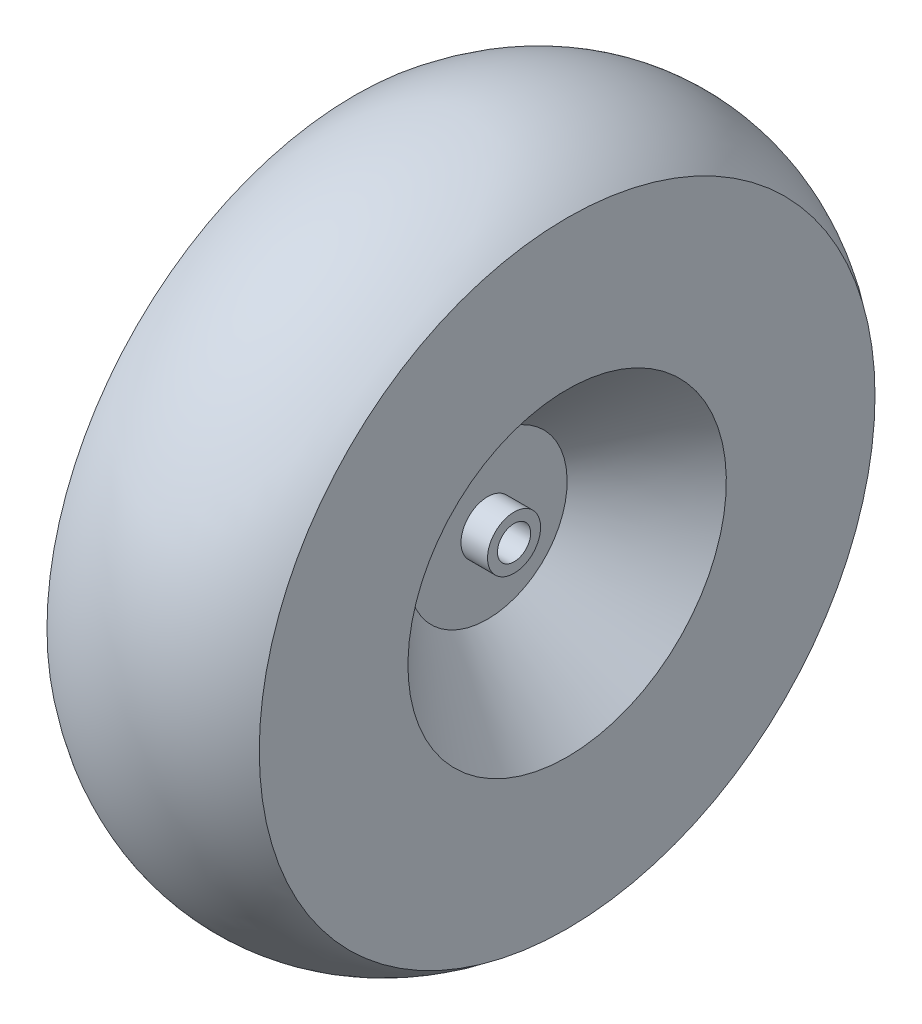
ISO-10303-21;
HEADER;
FILE_DESCRIPTION(('STEP AP214'),'2;1');
FILE_NAME('part.step','',(''),(''),'','','');
FILE_SCHEMA(('AUTOMOTIVE_DESIGN { 1 0 10303 214 1 1 1 1 }'));
ENDSEC;
DATA;
#1=APPLICATION_CONTEXT('core data for automotive mechanical design processes');
#2=APPLICATION_PROTOCOL_DEFINITION('international standard','automotive_design',2000,#1);
#3=PRODUCT_CONTEXT('',#1,'mechanical');
#4=PRODUCT('Part','Part','',(#3));
#5=PRODUCT_RELATED_PRODUCT_CATEGORY('part','',(#4));
#6=PRODUCT_DEFINITION_FORMATION('','',#4);
#7=PRODUCT_DEFINITION_CONTEXT('part definition',#1,'design');
#8=PRODUCT_DEFINITION('design','',#6,#7);
#9=PRODUCT_DEFINITION_SHAPE('','',#8);
#10=(LENGTH_UNIT() NAMED_UNIT(*) SI_UNIT(.MILLI.,.METRE.));
#11=(NAMED_UNIT(*) PLANE_ANGLE_UNIT() SI_UNIT($,.RADIAN.));
#12=(NAMED_UNIT(*) SI_UNIT($,.STERADIAN.) SOLID_ANGLE_UNIT());
#13=UNCERTAINTY_MEASURE_WITH_UNIT(LENGTH_MEASURE(1.E-05),#10,'distance_accuracy_value','');
#14=(GEOMETRIC_REPRESENTATION_CONTEXT(3) GLOBAL_UNCERTAINTY_ASSIGNED_CONTEXT((#13)) GLOBAL_UNIT_ASSIGNED_CONTEXT((#10,
#11,#12)) REPRESENTATION_CONTEXT('',''));
#15=CARTESIAN_POINT('',(0.,0.,0.));
#16=DIRECTION('',(0.,0.,1.));
#17=DIRECTION('',(1.,0.,0.));
#18=AXIS2_PLACEMENT_3D('',#15,#16,#17);
#19=CARTESIAN_POINT('',(50.8,0.,0.));
#20=DIRECTION('',(-1.,0.,0.));
#21=DIRECTION('',(0.,-1.,0.));
#22=AXIS2_PLACEMENT_3D('',#19,#20,#21);
#23=PLANE('',#22);
#24=CARTESIAN_POINT('',(50.8,0.,0.));
#25=DIRECTION('',(-1.,0.,0.));
#26=DIRECTION('',(0.,-1.,0.));
#27=AXIS2_PLACEMENT_3D('',#24,#25,#26);
#28=CIRCLE('',#27,147.358651079845);
#29=CARTESIAN_POINT('',(50.8,-147.358651079845,0.));
#30=VERTEX_POINT('',#29);
#31=EDGE_CURVE('E10',#30,#30,#28,.T.);
#32=ORIENTED_EDGE('',*,*,#31,.F.);
#33=EDGE_LOOP('',(#32));
#34=FACE_BOUND('',#33,.T.);
#35=CARTESIAN_POINT('',(50.8,0.,0.));
#36=DIRECTION('',(-1.,0.,0.));
#37=DIRECTION('',(0.,-1.,0.));
#38=AXIS2_PLACEMENT_3D('',#35,#36,#37);
#39=CIRCLE('',#38,76.2);
#40=CARTESIAN_POINT('',(50.8,-76.2,0.));
#41=VERTEX_POINT('',#40);
#42=EDGE_CURVE('E83',#41,#41,#39,.T.);
#43=ORIENTED_EDGE('',*,*,#42,.T.);
#44=EDGE_LOOP('',(#43));
#45=FACE_BOUND('',#44,.T.);
#46=ADVANCED_FACE('F43',(#34,#45),#23,.F.);
#47=CARTESIAN_POINT('',(0.,79.5701073445165,0.));
#48=DIRECTION('',(0.,0.,1.));
#49=DIRECTION('',(0.,-1.,0.));
#50=AXIS2_PLACEMENT_3D('',#47,#48,#49);
#51=ELLIPSE('',#50,85.5298926554835,83.3088481565609);
#52=TRIMMED_CURVE('',#51,(PARAMETER_VALUE(0.375513902886624)),
(PARAMETER_VALUE(5.90767140429296)),.T.,.PARAMETER.);
#53=CARTESIAN_POINT('',(-25.4,0.,0.));
#54=DIRECTION('',(-1.,0.,0.));
#55=AXIS1_PLACEMENT('',#53,#54);
#56=SURFACE_OF_REVOLUTION('',#52,#55);
#57=CARTESIAN_POINT('',(-50.8,0.,0.));
#58=DIRECTION('',(-1.,0.,0.));
#59=DIRECTION('',(0.,-1.,0.));
#60=AXIS2_PLACEMENT_3D('',#57,#58,#59);
#61=CIRCLE('',#60,147.358651079845);
#62=CARTESIAN_POINT('',(-50.7999999999999,-147.358651079845,0.));
#63=VERTEX_POINT('',#62);
#64=EDGE_CURVE('E49',#63,#63,#61,.T.);
#65=ORIENTED_EDGE('',*,*,#64,.F.);
#66=EDGE_LOOP('',(#65));
#67=FACE_BOUND('',#66,.T.);
#68=ORIENTED_EDGE('',*,*,#31,.T.);
#69=EDGE_LOOP('',(#68));
#70=FACE_BOUND('',#69,.T.);
#71=ADVANCED_FACE('F87',(#67,#70),#56,.T.);
#72=CARTESIAN_POINT('',(-50.8,0.,0.));
#73=DIRECTION('',(-1.,0.,0.));
#74=DIRECTION('',(0.,-1.,0.));
#75=AXIS2_PLACEMENT_3D('',#72,#73,#74);
#76=PLANE('',#75);
#77=ORIENTED_EDGE('',*,*,#64,.T.);
#78=EDGE_LOOP('',(#77));
#79=FACE_BOUND('',#78,.T.);
#80=CARTESIAN_POINT('',(-50.8,0.,0.));
#81=DIRECTION('',(-1.,0.,0.));
#82=DIRECTION('',(0.,-1.,0.));
#83=AXIS2_PLACEMENT_3D('',#80,#81,#82);
#84=CIRCLE('',#83,76.2);
#85=CARTESIAN_POINT('',(-50.8,-76.2,0.));
#86=VERTEX_POINT('',#85);
#87=EDGE_CURVE('E53',#86,#86,#84,.T.);
#88=ORIENTED_EDGE('',*,*,#87,.F.);
#89=EDGE_LOOP('',(#88));
#90=FACE_BOUND('',#89,.T.);
#91=ADVANCED_FACE('F90',(#79,#90),#76,.T.);
#92=CARTESIAN_POINT('',(-12.7,0.,0.));
#93=DIRECTION('',(-1.,0.,0.));
#94=DIRECTION('',(0.,-1.,0.));
#95=AXIS2_PLACEMENT_3D('',#92,#93,#94);
#96=CONICAL_SURFACE('',#95,38.0999999999999,0.78539816339745);
#97=ORIENTED_EDGE('',*,*,#87,.T.);
#98=EDGE_LOOP('',(#97));
#99=FACE_BOUND('',#98,.T.);
#100=CARTESIAN_POINT('',(-12.7,0.,0.));
#101=DIRECTION('',(-1.,0.,0.));
#102=DIRECTION('',(0.,-1.,0.));
#103=AXIS2_PLACEMENT_3D('',#100,#101,#102);
#104=CIRCLE('',#103,38.0999999999999);
#105=CARTESIAN_POINT('',(-12.7,-38.0999999999999,0.));
#106=VERTEX_POINT('',#105);
#107=EDGE_CURVE('E57',#106,#106,#104,.T.);
#108=ORIENTED_EDGE('',*,*,#107,.F.);
#109=EDGE_LOOP('',(#108));
#110=FACE_BOUND('',#109,.T.);
#111=ADVANCED_FACE('F94',(#99,#110),#96,.F.);
#112=CARTESIAN_POINT('',(-12.7,0.,0.));
#113=DIRECTION('',(-1.,0.,0.));
#114=DIRECTION('',(0.,-1.,0.));
#115=AXIS2_PLACEMENT_3D('',#112,#113,#114);
#116=PLANE('',#115);
#117=ORIENTED_EDGE('',*,*,#107,.T.);
#118=EDGE_LOOP('',(#117));
#119=FACE_BOUND('',#118,.T.);
#120=CARTESIAN_POINT('',(-12.7,0.,0.));
#121=DIRECTION('',(-1.,0.,0.));
#122=DIRECTION('',(0.,-1.,0.));
#123=AXIS2_PLACEMENT_3D('',#120,#121,#122);
#124=CIRCLE('',#123,12.7);
#125=CARTESIAN_POINT('',(-12.7,-12.7,0.));
#126=VERTEX_POINT('',#125);
#127=EDGE_CURVE('E62',#126,#126,#124,.T.);
#128=ORIENTED_EDGE('',*,*,#127,.F.);
#129=EDGE_LOOP('',(#128));
#130=FACE_BOUND('',#129,.T.);
#131=ADVANCED_FACE('F97',(#119,#130),#116,.T.);
#132=CARTESIAN_POINT('',(-25.4,0.,0.));
#133=DIRECTION('',(-1.,0.,0.));
#134=DIRECTION('',(0.,-1.,0.));
#135=AXIS2_PLACEMENT_3D('',#132,#133,#134);
#136=CYLINDRICAL_SURFACE('',#135,12.7);
#137=CARTESIAN_POINT('',(-25.4,0.,0.));
#138=DIRECTION('',(-1.,0.,0.));
#139=DIRECTION('',(0.,-1.,0.));
#140=AXIS2_PLACEMENT_3D('',#137,#138,#139);
#141=CIRCLE('',#140,12.7);
#142=CARTESIAN_POINT('',(-25.4,-12.7,0.));
#143=VERTEX_POINT('',#142);
#144=EDGE_CURVE('E65',#143,#143,#141,.T.);
#145=ORIENTED_EDGE('',*,*,#144,.F.);
#146=EDGE_LOOP('',(#145));
#147=FACE_BOUND('',#146,.T.);
#148=ORIENTED_EDGE('',*,*,#127,.T.);
#149=EDGE_LOOP('',(#148));
#150=FACE_BOUND('',#149,.T.);
#151=ADVANCED_FACE('F101',(#147,#150),#136,.T.);
#152=CARTESIAN_POINT('',(-25.4,0.,0.));
#153=DIRECTION('',(-1.,0.,0.));
#154=DIRECTION('',(0.,-1.,0.));
#155=AXIS2_PLACEMENT_3D('',#152,#153,#154);
#156=PLANE('',#155);
#157=ORIENTED_EDGE('',*,*,#144,.T.);
#158=EDGE_LOOP('',(#157));
#159=FACE_BOUND('',#158,.T.);
#160=CARTESIAN_POINT('',(-25.4,0.,0.));
#161=DIRECTION('',(-1.,0.,0.));
#162=DIRECTION('',(0.,-1.,0.));
#163=AXIS2_PLACEMENT_3D('',#160,#161,#162);
#164=CIRCLE('',#163,7.93749999999999);
#165=CARTESIAN_POINT('',(-25.4,-7.93749999999999,0.));
#166=VERTEX_POINT('',#165);
#167=EDGE_CURVE('E68',#166,#166,#164,.T.);
#168=ORIENTED_EDGE('',*,*,#167,.F.);
#169=EDGE_LOOP('',(#168));
#170=FACE_BOUND('',#169,.T.);
#171=ADVANCED_FACE('F105',(#159,#170),#156,.T.);
#172=CARTESIAN_POINT('',(-25.4,0.,0.));
#173=DIRECTION('',(-1.,0.,0.));
#174=DIRECTION('',(0.,-1.,0.));
#175=AXIS2_PLACEMENT_3D('',#172,#173,#174);
#176=CYLINDRICAL_SURFACE('',#175,7.93749999999999);
#177=ORIENTED_EDGE('',*,*,#167,.T.);
#178=EDGE_LOOP('',(#177));
#179=FACE_BOUND('',#178,.T.);
#180=CARTESIAN_POINT('',(25.4,0.,0.));
#181=DIRECTION('',(-1.,0.,0.));
#182=DIRECTION('',(0.,-1.,0.));
#183=AXIS2_PLACEMENT_3D('',#180,#181,#182);
#184=CIRCLE('',#183,7.93749999999999);
#185=CARTESIAN_POINT('',(25.4,-7.93749999999998,0.));
#186=VERTEX_POINT('',#185);
#187=EDGE_CURVE('E71',#186,#186,#184,.T.);
#188=ORIENTED_EDGE('',*,*,#187,.F.);
#189=EDGE_LOOP('',(#188));
#190=FACE_BOUND('',#189,.T.);
#191=ADVANCED_FACE('F109',(#179,#190),#176,.F.);
#192=CARTESIAN_POINT('',(25.4,0.,0.));
#193=DIRECTION('',(-1.,0.,0.));
#194=DIRECTION('',(0.,-1.,0.));
#195=AXIS2_PLACEMENT_3D('',#192,#193,#194);
#196=PLANE('',#195);
#197=CARTESIAN_POINT('',(25.4,0.,0.));
#198=DIRECTION('',(-1.,0.,0.));
#199=DIRECTION('',(0.,-1.,0.));
#200=AXIS2_PLACEMENT_3D('',#197,#198,#199);
#201=CIRCLE('',#200,12.7);
#202=CARTESIAN_POINT('',(25.4,-12.7,0.));
#203=VERTEX_POINT('',#202);
#204=EDGE_CURVE('E74',#203,#203,#201,.T.);
#205=ORIENTED_EDGE('',*,*,#204,.F.);
#206=EDGE_LOOP('',(#205));
#207=FACE_BOUND('',#206,.T.);
#208=ORIENTED_EDGE('',*,*,#187,.T.);
#209=EDGE_LOOP('',(#208));
#210=FACE_BOUND('',#209,.T.);
#211=ADVANCED_FACE('F113',(#207,#210),#196,.F.);
#212=CARTESIAN_POINT('',(-25.4,0.,0.));
#213=DIRECTION('',(-1.,0.,0.));
#214=DIRECTION('',(0.,-1.,0.));
#215=AXIS2_PLACEMENT_3D('',#212,#213,#214);
#216=CYLINDRICAL_SURFACE('',#215,12.7);
#217=ORIENTED_EDGE('',*,*,#204,.T.);
#218=EDGE_LOOP('',(#217));
#219=FACE_BOUND('',#218,.T.);
#220=CARTESIAN_POINT('',(12.7,0.,0.));
#221=DIRECTION('',(-1.,0.,0.));
#222=DIRECTION('',(0.,-1.,0.));
#223=AXIS2_PLACEMENT_3D('',#220,#221,#222);
#224=CIRCLE('',#223,12.7);
#225=CARTESIAN_POINT('',(12.7,-12.7,0.));
#226=VERTEX_POINT('',#225);
#227=EDGE_CURVE('E77',#226,#226,#224,.T.);
#228=ORIENTED_EDGE('',*,*,#227,.F.);
#229=EDGE_LOOP('',(#228));
#230=FACE_BOUND('',#229,.T.);
#231=ADVANCED_FACE('F117',(#219,#230),#216,.T.);
#232=CARTESIAN_POINT('',(12.7,0.,0.));
#233=DIRECTION('',(-1.,0.,0.));
#234=DIRECTION('',(0.,-1.,0.));
#235=AXIS2_PLACEMENT_3D('',#232,#233,#234);
#236=PLANE('',#235);
#237=CARTESIAN_POINT('',(12.7,0.,0.));
#238=DIRECTION('',(-1.,0.,0.));
#239=DIRECTION('',(0.,-1.,0.));
#240=AXIS2_PLACEMENT_3D('',#237,#238,#239);
#241=CIRCLE('',#240,38.0999999999999);
#242=CARTESIAN_POINT('',(12.7,-38.0999999999999,0.));
#243=VERTEX_POINT('',#242);
#244=EDGE_CURVE('E80',#243,#243,#241,.T.);
#245=ORIENTED_EDGE('',*,*,#244,.F.);
#246=EDGE_LOOP('',(#245));
#247=FACE_BOUND('',#246,.T.);
#248=ORIENTED_EDGE('',*,*,#227,.T.);
#249=EDGE_LOOP('',(#248));
#250=FACE_BOUND('',#249,.T.);
#251=ADVANCED_FACE('F121',(#247,#250),#236,.F.);
#252=CARTESIAN_POINT('',(12.7,0.,0.));
#253=DIRECTION('',(1.,0.,0.));
#254=DIRECTION('',(0.,1.,0.));
#255=AXIS2_PLACEMENT_3D('',#252,#253,#254);
#256=CONICAL_SURFACE('',#255,38.0999999999999,0.78539816339745);
#257=ORIENTED_EDGE('',*,*,#42,.F.);
#258=EDGE_LOOP('',(#257));
#259=FACE_BOUND('',#258,.T.);
#260=ORIENTED_EDGE('',*,*,#244,.T.);
#261=EDGE_LOOP('',(#260));
#262=FACE_BOUND('',#261,.T.);
#263=ADVANCED_FACE('F125',(#259,#262),#256,.F.);
#264=CLOSED_SHELL('',(#46,#71,#91,#111,#131,#151,#171,#191,#211,#231,#251,#263));
#265=MANIFOLD_SOLID_BREP('B2',#264);
#266=ADVANCED_BREP_SHAPE_REPRESENTATION('',(#18,#265),#14);
#267=SHAPE_DEFINITION_REPRESENTATION(#9,#266);
ENDSEC;
END-ISO-10303-21;
